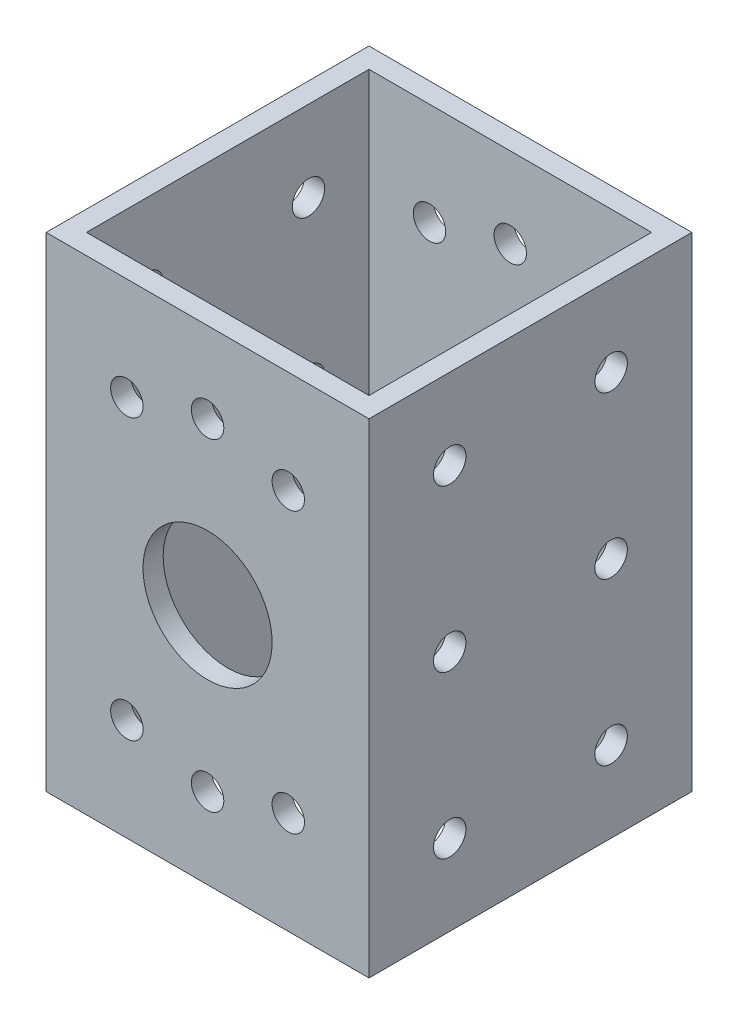
ISO-10303-21;
HEADER;
FILE_DESCRIPTION(('STEP AP214'),'2;1');
FILE_NAME('part.step','',(''),(''),'','','');
FILE_SCHEMA(('AUTOMOTIVE_DESIGN { 1 0 10303 214 1 1 1 1 }'));
ENDSEC;
DATA;
#1=APPLICATION_CONTEXT('core data for automotive mechanical design processes');
#2=APPLICATION_PROTOCOL_DEFINITION('international standard','automotive_design',2000,#1);
#3=PRODUCT_CONTEXT('',#1,'mechanical');
#4=PRODUCT('Part','Part','',(#3));
#5=PRODUCT_RELATED_PRODUCT_CATEGORY('part','',(#4));
#6=PRODUCT_DEFINITION_FORMATION('','',#4);
#7=PRODUCT_DEFINITION_CONTEXT('part definition',#1,'design');
#8=PRODUCT_DEFINITION('design','',#6,#7);
#9=PRODUCT_DEFINITION_SHAPE('','',#8);
#10=(LENGTH_UNIT() NAMED_UNIT(*) SI_UNIT(.MILLI.,.METRE.));
#11=(NAMED_UNIT(*) PLANE_ANGLE_UNIT() SI_UNIT($,.RADIAN.));
#12=(NAMED_UNIT(*) SI_UNIT($,.STERADIAN.) SOLID_ANGLE_UNIT());
#13=UNCERTAINTY_MEASURE_WITH_UNIT(LENGTH_MEASURE(1.E-05),#10,'distance_accuracy_value','');
#14=(GEOMETRIC_REPRESENTATION_CONTEXT(3) GLOBAL_UNCERTAINTY_ASSIGNED_CONTEXT((#13)) GLOBAL_UNIT_ASSIGNED_CONTEXT((#10,
#11,#12)) REPRESENTATION_CONTEXT('',''));
#15=CARTESIAN_POINT('',(0.,0.,0.));
#16=DIRECTION('',(0.,0.,1.));
#17=DIRECTION('',(1.,0.,0.));
#18=AXIS2_PLACEMENT_3D('',#15,#16,#17);
#19=CARTESIAN_POINT('',(0.,76.2,0.));
#20=DIRECTION('',(0.,-1.,0.));
#21=DIRECTION('',(0.,0.,-1.));
#22=AXIS2_PLACEMENT_3D('',#19,#20,#21);
#23=PLANE('',#22);
#24=DIRECTION('',(0.,0.,-1.));
#25=VECTOR('',#24,1.);
#26=CARTESIAN_POINT('',(25.4,76.2,25.4));
#27=LINE('',#26,#25);
#28=CARTESIAN_POINT('',(25.4,76.2,25.4));
#29=VERTEX_POINT('',#28);
#30=CARTESIAN_POINT('',(25.4,76.2,-25.4));
#31=VERTEX_POINT('',#30);
#32=EDGE_CURVE('E144',#29,#31,#27,.T.);
#33=ORIENTED_EDGE('',*,*,#32,.T.);
#34=DIRECTION('',(-1.,0.,0.));
#35=VECTOR('',#34,1.);
#36=CARTESIAN_POINT('',(-25.4,76.2,-25.4));
#37=LINE('',#36,#35);
#38=CARTESIAN_POINT('',(-25.4,76.2,-25.4));
#39=VERTEX_POINT('',#38);
#40=EDGE_CURVE('E147',#31,#39,#37,.T.);
#41=ORIENTED_EDGE('',*,*,#40,.T.);
#42=DIRECTION('',(0.,0.,1.));
#43=VECTOR('',#42,1.);
#44=CARTESIAN_POINT('',(-25.4,76.2,25.4));
#45=LINE('',#44,#43);
#46=CARTESIAN_POINT('',(-25.4,76.2,25.4));
#47=VERTEX_POINT('',#46);
#48=EDGE_CURVE('E150',#39,#47,#45,.T.);
#49=ORIENTED_EDGE('',*,*,#48,.T.);
#50=DIRECTION('',(1.,0.,0.));
#51=VECTOR('',#50,1.);
#52=CARTESIAN_POINT('',(-25.4,76.2,25.4));
#53=LINE('',#52,#51);
#54=EDGE_CURVE('E152',#47,#29,#53,.T.);
#55=ORIENTED_EDGE('',*,*,#54,.T.);
#56=EDGE_LOOP('',(#33,#41,#49,#55));
#57=FACE_BOUND('',#56,.T.);
#58=DIRECTION('',(0.,0.,-1.));
#59=VECTOR('',#58,1.);
#60=CARTESIAN_POINT('',(22.225,76.2,22.225));
#61=LINE('',#60,#59);
#62=CARTESIAN_POINT('',(22.225,76.2,22.225));
#63=VERTEX_POINT('',#62);
#64=CARTESIAN_POINT('',(22.225,76.2,-22.225));
#65=VERTEX_POINT('',#64);
#66=EDGE_CURVE('E106',#63,#65,#61,.T.);
#67=ORIENTED_EDGE('',*,*,#66,.F.);
#68=DIRECTION('',(1.,0.,0.));
#69=VECTOR('',#68,1.);
#70=CARTESIAN_POINT('',(-22.225,76.2,22.225));
#71=LINE('',#70,#69);
#72=CARTESIAN_POINT('',(-22.225,76.2,22.225));
#73=VERTEX_POINT('',#72);
#74=EDGE_CURVE('E128',#73,#63,#71,.T.);
#75=ORIENTED_EDGE('',*,*,#74,.F.);
#76=DIRECTION('',(0.,0.,1.));
#77=VECTOR('',#76,1.);
#78=CARTESIAN_POINT('',(-22.225,76.2,22.225));
#79=LINE('',#78,#77);
#80=CARTESIAN_POINT('',(-22.225,76.2,-22.225));
#81=VERTEX_POINT('',#80);
#82=EDGE_CURVE('E126',#81,#73,#79,.T.);
#83=ORIENTED_EDGE('',*,*,#82,.F.);
#84=DIRECTION('',(-1.,0.,0.));
#85=VECTOR('',#84,1.);
#86=CARTESIAN_POINT('',(-22.225,76.2,-22.225));
#87=LINE('',#86,#85);
#88=EDGE_CURVE('E114',#65,#81,#87,.T.);
#89=ORIENTED_EDGE('',*,*,#88,.F.);
#90=EDGE_LOOP('',(#67,#75,#83,#89));
#91=FACE_BOUND('',#90,.T.);
#92=ADVANCED_FACE('F39',(#57,#91),#23,.F.);
#93=CARTESIAN_POINT('',(0.,0.,0.));
#94=DIRECTION('',(0.,-1.,0.));
#95=DIRECTION('',(0.,0.,-1.));
#96=AXIS2_PLACEMENT_3D('',#93,#94,#95);
#97=PLANE('',#96);
#98=DIRECTION('',(0.,0.,-1.));
#99=VECTOR('',#98,1.);
#100=CARTESIAN_POINT('',(25.4,0.,25.4));
#101=LINE('',#100,#99);
#102=CARTESIAN_POINT('',(25.4,0.,25.4));
#103=VERTEX_POINT('',#102);
#104=CARTESIAN_POINT('',(25.4,0.,-25.4));
#105=VERTEX_POINT('',#104);
#106=EDGE_CURVE('E122',#103,#105,#101,.T.);
#107=ORIENTED_EDGE('',*,*,#106,.F.);
#108=DIRECTION('',(1.,0.,0.));
#109=VECTOR('',#108,1.);
#110=CARTESIAN_POINT('',(-25.4,0.,25.4));
#111=LINE('',#110,#109);
#112=CARTESIAN_POINT('',(-25.4,0.,25.4));
#113=VERTEX_POINT('',#112);
#114=EDGE_CURVE('E148',#113,#103,#111,.T.);
#115=ORIENTED_EDGE('',*,*,#114,.F.);
#116=DIRECTION('',(0.,0.,1.));
#117=VECTOR('',#116,1.);
#118=CARTESIAN_POINT('',(-25.4,0.,25.4));
#119=LINE('',#118,#117);
#120=CARTESIAN_POINT('',(-25.4,0.,-25.4));
#121=VERTEX_POINT('',#120);
#122=EDGE_CURVE('E159',#121,#113,#119,.T.);
#123=ORIENTED_EDGE('',*,*,#122,.F.);
#124=DIRECTION('',(-1.,0.,0.));
#125=VECTOR('',#124,1.);
#126=CARTESIAN_POINT('',(-25.4,0.,-25.4));
#127=LINE('',#126,#125);
#128=EDGE_CURVE('E157',#105,#121,#127,.T.);
#129=ORIENTED_EDGE('',*,*,#128,.F.);
#130=EDGE_LOOP('',(#107,#115,#123,#129));
#131=FACE_BOUND('',#130,.T.);
#132=DIRECTION('',(1.,0.,0.));
#133=VECTOR('',#132,1.);
#134=CARTESIAN_POINT('',(-22.225,0.,22.225));
#135=LINE('',#134,#133);
#136=CARTESIAN_POINT('',(-22.225,0.,22.225));
#137=VERTEX_POINT('',#136);
#138=CARTESIAN_POINT('',(22.225,0.,22.225));
#139=VERTEX_POINT('',#138);
#140=EDGE_CURVE('E115',#137,#139,#135,.T.);
#141=ORIENTED_EDGE('',*,*,#140,.T.);
#142=DIRECTION('',(0.,0.,-1.));
#143=VECTOR('',#142,1.);
#144=CARTESIAN_POINT('',(22.225,0.,22.225));
#145=LINE('',#144,#143);
#146=CARTESIAN_POINT('',(22.225,0.,-22.225));
#147=VERTEX_POINT('',#146);
#148=EDGE_CURVE('E64',#139,#147,#145,.T.);
#149=ORIENTED_EDGE('',*,*,#148,.T.);
#150=DIRECTION('',(-1.,0.,0.));
#151=VECTOR('',#150,1.);
#152=CARTESIAN_POINT('',(-22.225,0.,-22.225));
#153=LINE('',#152,#151);
#154=CARTESIAN_POINT('',(-22.225,0.,-22.225));
#155=VERTEX_POINT('',#154);
#156=EDGE_CURVE('E121',#147,#155,#153,.T.);
#157=ORIENTED_EDGE('',*,*,#156,.T.);
#158=DIRECTION('',(0.,0.,1.));
#159=VECTOR('',#158,1.);
#160=CARTESIAN_POINT('',(-22.225,0.,22.225));
#161=LINE('',#160,#159);
#162=EDGE_CURVE('E136',#155,#137,#161,.T.);
#163=ORIENTED_EDGE('',*,*,#162,.T.);
#164=EDGE_LOOP('',(#141,#149,#157,#163));
#165=FACE_BOUND('',#164,.T.);
#166=ADVANCED_FACE('F278',(#131,#165),#97,.T.);
#167=CARTESIAN_POINT('',(25.4,76.2,25.4));
#168=DIRECTION('',(-1.,0.,0.));
#169=DIRECTION('',(0.,0.,1.));
#170=AXIS2_PLACEMENT_3D('',#167,#168,#169);
#171=PLANE('',#170);
#172=CARTESIAN_POINT('',(25.4,63.5,12.7));
#173=DIRECTION('',(-1.,0.,0.));
#174=DIRECTION('',(0.,0.,1.));
#175=AXIS2_PLACEMENT_3D('',#172,#173,#174);
#176=CIRCLE('',#175,2.5527);
#177=CARTESIAN_POINT('',(25.4,63.5,15.2527));
#178=VERTEX_POINT('',#177);
#179=EDGE_CURVE('E450',#178,#178,#176,.T.);
#180=ORIENTED_EDGE('',*,*,#179,.T.);
#181=EDGE_LOOP('',(#180));
#182=FACE_BOUND('',#181,.T.);
#183=CARTESIAN_POINT('',(25.4,38.1,12.7));
#184=DIRECTION('',(-1.,0.,0.));
#185=DIRECTION('',(0.,0.,1.));
#186=AXIS2_PLACEMENT_3D('',#183,#184,#185);
#187=CIRCLE('',#186,2.5527);
#188=CARTESIAN_POINT('',(25.4,38.1,15.2527));
#189=VERTEX_POINT('',#188);
#190=EDGE_CURVE('E456',#189,#189,#187,.T.);
#191=ORIENTED_EDGE('',*,*,#190,.T.);
#192=EDGE_LOOP('',(#191));
#193=FACE_BOUND('',#192,.T.);
#194=CARTESIAN_POINT('',(25.4,12.7,12.7));
#195=DIRECTION('',(-1.,0.,0.));
#196=DIRECTION('',(0.,0.,1.));
#197=AXIS2_PLACEMENT_3D('',#194,#195,#196);
#198=CIRCLE('',#197,2.5527);
#199=CARTESIAN_POINT('',(25.4,12.7,15.2527));
#200=VERTEX_POINT('',#199);
#201=EDGE_CURVE('E462',#200,#200,#198,.T.);
#202=ORIENTED_EDGE('',*,*,#201,.T.);
#203=EDGE_LOOP('',(#202));
#204=FACE_BOUND('',#203,.T.);
#205=CARTESIAN_POINT('',(25.4,63.5,-12.7));
#206=DIRECTION('',(-1.,0.,0.));
#207=DIRECTION('',(0.,0.,1.));
#208=AXIS2_PLACEMENT_3D('',#205,#206,#207);
#209=CIRCLE('',#208,2.5527);
#210=CARTESIAN_POINT('',(25.4,63.5,-10.1473));
#211=VERTEX_POINT('',#210);
#212=EDGE_CURVE('E468',#211,#211,#209,.T.);
#213=ORIENTED_EDGE('',*,*,#212,.T.);
#214=EDGE_LOOP('',(#213));
#215=FACE_BOUND('',#214,.T.);
#216=CARTESIAN_POINT('',(25.4,38.1,-12.7));
#217=DIRECTION('',(-1.,0.,0.));
#218=DIRECTION('',(0.,0.,1.));
#219=AXIS2_PLACEMENT_3D('',#216,#217,#218);
#220=CIRCLE('',#219,2.5527);
#221=CARTESIAN_POINT('',(25.4,38.1,-10.1473));
#222=VERTEX_POINT('',#221);
#223=EDGE_CURVE('E474',#222,#222,#220,.T.);
#224=ORIENTED_EDGE('',*,*,#223,.T.);
#225=EDGE_LOOP('',(#224));
#226=FACE_BOUND('',#225,.T.);
#227=CARTESIAN_POINT('',(25.4,12.7,-12.7));
#228=DIRECTION('',(-1.,0.,0.));
#229=DIRECTION('',(0.,0.,1.));
#230=AXIS2_PLACEMENT_3D('',#227,#228,#229);
#231=CIRCLE('',#230,2.5527);
#232=CARTESIAN_POINT('',(25.4,12.7,-10.1473));
#233=VERTEX_POINT('',#232);
#234=EDGE_CURVE('E478',#233,#233,#231,.T.);
#235=ORIENTED_EDGE('',*,*,#234,.T.);
#236=EDGE_LOOP('',(#235));
#237=FACE_BOUND('',#236,.T.);
#238=ORIENTED_EDGE('',*,*,#106,.T.);
#239=DIRECTION('',(0.,-1.,0.));
#240=VECTOR('',#239,1.);
#241=CARTESIAN_POINT('',(25.4,76.2,-25.4));
#242=LINE('',#241,#240);
#243=EDGE_CURVE('E11',#31,#105,#242,.T.);
#244=ORIENTED_EDGE('',*,*,#243,.F.);
#245=ORIENTED_EDGE('',*,*,#32,.F.);
#246=DIRECTION('',(0.,-1.,0.));
#247=VECTOR('',#246,1.);
#248=CARTESIAN_POINT('',(25.4,76.2,25.4));
#249=LINE('',#248,#247);
#250=EDGE_CURVE('E154',#29,#103,#249,.T.);
#251=ORIENTED_EDGE('',*,*,#250,.T.);
#252=EDGE_LOOP('',(#238,#244,#245,#251));
#253=FACE_BOUND('',#252,.T.);
#254=ADVANCED_FACE('F41',(#182,#193,#204,#215,#226,#237,#253),#171,.F.);
#255=CARTESIAN_POINT('',(-25.4,76.2,-25.4));
#256=DIRECTION('',(0.,0.,1.));
#257=DIRECTION('',(1.,0.,0.));
#258=AXIS2_PLACEMENT_3D('',#255,#256,#257);
#259=PLANE('',#258);
#260=CARTESIAN_POINT('',(0.,38.1,-25.4));
#261=DIRECTION('',(0.,0.,1.));
#262=DIRECTION('',(1.,0.,0.));
#263=AXIS2_PLACEMENT_3D('',#260,#261,#262);
#264=CIRCLE('',#263,10.16);
#265=CARTESIAN_POINT('',(10.16,38.1,-25.4));
#266=VERTEX_POINT('',#265);
#267=EDGE_CURVE('E196',#266,#266,#264,.T.);
#268=ORIENTED_EDGE('',*,*,#267,.T.);
#269=EDGE_LOOP('',(#268));
#270=FACE_BOUND('',#269,.T.);
#271=CARTESIAN_POINT('',(-12.6999999999997,16.1029547438751,-25.4));
#272=DIRECTION('',(0.,0.,1.));
#273=DIRECTION('',(0.866025403784445,-0.499999999999989,0.));
#274=AXIS2_PLACEMENT_3D('',#271,#272,#273);
#275=CIRCLE('',#274,2.5527);
#276=CARTESIAN_POINT('',(-10.4892969517592,14.8266047438751,-25.4));
#277=VERTEX_POINT('',#276);
#278=EDGE_CURVE('E232',#277,#277,#275,.T.);
#279=ORIENTED_EDGE('',*,*,#278,.T.);
#280=EDGE_LOOP('',(#279));
#281=FACE_BOUND('',#280,.T.);
#282=CARTESIAN_POINT('',(-12.7000000000002,60.0970452561247,-25.4));
#283=DIRECTION('',(0.,0.,1.));
#284=DIRECTION('',(-0.866025403784435,-0.500000000000007,0.));
#285=AXIS2_PLACEMENT_3D('',#282,#283,#284);
#286=CIRCLE('',#285,2.5527);
#287=CARTESIAN_POINT('',(-14.9107030482407,58.8206952561246,-25.4));
#288=VERTEX_POINT('',#287);
#289=EDGE_CURVE('E226',#288,#288,#286,.T.);
#290=ORIENTED_EDGE('',*,*,#289,.T.);
#291=EDGE_LOOP('',(#290));
#292=FACE_BOUND('',#291,.T.);
#293=CARTESIAN_POINT('',(0.,63.5,-25.4));
#294=DIRECTION('',(0.,0.,1.));
#295=DIRECTION('',(-1.,0.,0.));
#296=AXIS2_PLACEMENT_3D('',#293,#294,#295);
#297=CIRCLE('',#296,2.5527);
#298=CARTESIAN_POINT('',(-2.5527,63.5,-25.4));
#299=VERTEX_POINT('',#298);
#300=EDGE_CURVE('E220',#299,#299,#297,.T.);
#301=ORIENTED_EDGE('',*,*,#300,.T.);
#302=EDGE_LOOP('',(#301));
#303=FACE_BOUND('',#302,.T.);
#304=CARTESIAN_POINT('',(12.6999999999999,60.0970452561248,-25.4));
#305=DIRECTION('',(0.,0.,1.));
#306=DIRECTION('',(-0.866025403784442,0.499999999999995,0.));
#307=AXIS2_PLACEMENT_3D('',#304,#305,#306);
#308=CIRCLE('',#307,2.5527);
#309=CARTESIAN_POINT('',(10.4892969517593,61.3733952561248,-25.4));
#310=VERTEX_POINT('',#309);
#311=EDGE_CURVE('E213',#310,#310,#308,.T.);
#312=ORIENTED_EDGE('',*,*,#311,.T.);
#313=EDGE_LOOP('',(#312));
#314=FACE_BOUND('',#313,.T.);
#315=CARTESIAN_POINT('',(12.7,16.1029547438753,-25.4));
#316=DIRECTION('',(0.,0.,1.));
#317=DIRECTION('',(0.866025403784438,0.500000000000001,0.));
#318=AXIS2_PLACEMENT_3D('',#315,#316,#317);
#319=CIRCLE('',#318,2.5527);
#320=CARTESIAN_POINT('',(14.9107030482406,17.3793047438753,-25.4));
#321=VERTEX_POINT('',#320);
#322=EDGE_CURVE('E177',#321,#321,#319,.T.);
#323=ORIENTED_EDGE('',*,*,#322,.T.);
#324=EDGE_LOOP('',(#323));
#325=FACE_BOUND('',#324,.T.);
#326=CARTESIAN_POINT('',(0.,12.7,-25.4));
#327=DIRECTION('',(0.,0.,1.));
#328=DIRECTION('',(1.,0.,0.));
#329=AXIS2_PLACEMENT_3D('',#326,#327,#328);
#330=CIRCLE('',#329,2.5527);
#331=CARTESIAN_POINT('',(2.5527,12.7,-25.4));
#332=VERTEX_POINT('',#331);
#333=EDGE_CURVE('E172',#332,#332,#330,.T.);
#334=ORIENTED_EDGE('',*,*,#333,.T.);
#335=EDGE_LOOP('',(#334));
#336=FACE_BOUND('',#335,.T.);
#337=ORIENTED_EDGE('',*,*,#128,.T.);
#338=DIRECTION('',(0.,-1.,0.));
#339=VECTOR('',#338,1.);
#340=CARTESIAN_POINT('',(-25.4,76.2,-25.4));
#341=LINE('',#340,#339);
#342=EDGE_CURVE('E48',#39,#121,#341,.T.);
#343=ORIENTED_EDGE('',*,*,#342,.F.);
#344=ORIENTED_EDGE('',*,*,#40,.F.);
#345=ORIENTED_EDGE('',*,*,#243,.T.);
#346=EDGE_LOOP('',(#337,#343,#344,#345));
#347=FACE_BOUND('',#346,.T.);
#348=ADVANCED_FACE('F292',(#270,#281,#292,#303,#314,#325,#336,#347),#259,.F.);
#349=CARTESIAN_POINT('',(-25.4,76.2,25.4));
#350=DIRECTION('',(1.,0.,0.));
#351=DIRECTION('',(0.,0.,-1.));
#352=AXIS2_PLACEMENT_3D('',#349,#350,#351);
#353=PLANE('',#352);
#354=CARTESIAN_POINT('',(-25.4,63.5,12.7));
#355=DIRECTION('',(-1.,0.,0.));
#356=DIRECTION('',(0.,0.,1.));
#357=AXIS2_PLACEMENT_3D('',#354,#355,#356);
#358=CIRCLE('',#357,2.5527);
#359=CARTESIAN_POINT('',(-25.4,63.5,15.2527));
#360=VERTEX_POINT('',#359);
#361=EDGE_CURVE('E419',#360,#360,#358,.T.);
#362=ORIENTED_EDGE('',*,*,#361,.F.);
#363=EDGE_LOOP('',(#362));
#364=FACE_BOUND('',#363,.T.);
#365=CARTESIAN_POINT('',(-25.4,38.1,12.7));
#366=DIRECTION('',(-1.,0.,0.));
#367=DIRECTION('',(0.,0.,1.));
#368=AXIS2_PLACEMENT_3D('',#365,#366,#367);
#369=CIRCLE('',#368,2.5527);
#370=CARTESIAN_POINT('',(-25.4,38.1,15.2527));
#371=VERTEX_POINT('',#370);
#372=EDGE_CURVE('E423',#371,#371,#369,.T.);
#373=ORIENTED_EDGE('',*,*,#372,.F.);
#374=EDGE_LOOP('',(#373));
#375=FACE_BOUND('',#374,.T.);
#376=CARTESIAN_POINT('',(-25.4,12.7,12.7));
#377=DIRECTION('',(-1.,0.,0.));
#378=DIRECTION('',(0.,0.,1.));
#379=AXIS2_PLACEMENT_3D('',#376,#377,#378);
#380=CIRCLE('',#379,2.5527);
#381=CARTESIAN_POINT('',(-25.4,12.7,15.2527));
#382=VERTEX_POINT('',#381);
#383=EDGE_CURVE('E432',#382,#382,#380,.T.);
#384=ORIENTED_EDGE('',*,*,#383,.F.);
#385=EDGE_LOOP('',(#384));
#386=FACE_BOUND('',#385,.T.);
#387=CARTESIAN_POINT('',(-25.4,63.5,-12.7));
#388=DIRECTION('',(-1.,0.,0.));
#389=DIRECTION('',(0.,0.,1.));
#390=AXIS2_PLACEMENT_3D('',#387,#388,#389);
#391=CIRCLE('',#390,2.5527);
#392=CARTESIAN_POINT('',(-25.4,63.5,-10.1473));
#393=VERTEX_POINT('',#392);
#394=EDGE_CURVE('E438',#393,#393,#391,.T.);
#395=ORIENTED_EDGE('',*,*,#394,.F.);
#396=EDGE_LOOP('',(#395));
#397=FACE_BOUND('',#396,.T.);
#398=CARTESIAN_POINT('',(-25.4,38.1,-12.7));
#399=DIRECTION('',(-1.,0.,0.));
#400=DIRECTION('',(0.,0.,1.));
#401=AXIS2_PLACEMENT_3D('',#398,#399,#400);
#402=CIRCLE('',#401,2.5527);
#403=CARTESIAN_POINT('',(-25.4,38.1,-10.1473));
#404=VERTEX_POINT('',#403);
#405=EDGE_CURVE('E444',#404,#404,#402,.T.);
#406=ORIENTED_EDGE('',*,*,#405,.F.);
#407=EDGE_LOOP('',(#406));
#408=FACE_BOUND('',#407,.T.);
#409=CARTESIAN_POINT('',(-25.4,12.7,-12.7));
#410=DIRECTION('',(-1.,0.,0.));
#411=DIRECTION('',(0.,0.,1.));
#412=AXIS2_PLACEMENT_3D('',#409,#410,#411);
#413=CIRCLE('',#412,2.5527);
#414=CARTESIAN_POINT('',(-25.4,12.7,-10.1473));
#415=VERTEX_POINT('',#414);
#416=EDGE_CURVE('E477',#415,#415,#413,.T.);
#417=ORIENTED_EDGE('',*,*,#416,.F.);
#418=EDGE_LOOP('',(#417));
#419=FACE_BOUND('',#418,.T.);
#420=ORIENTED_EDGE('',*,*,#122,.T.);
#421=DIRECTION('',(0.,-1.,0.));
#422=VECTOR('',#421,1.);
#423=CARTESIAN_POINT('',(-25.4,76.2,25.4));
#424=LINE('',#423,#422);
#425=EDGE_CURVE('E164',#47,#113,#424,.T.);
#426=ORIENTED_EDGE('',*,*,#425,.F.);
#427=ORIENTED_EDGE('',*,*,#48,.F.);
#428=ORIENTED_EDGE('',*,*,#342,.T.);
#429=EDGE_LOOP('',(#420,#426,#427,#428));
#430=FACE_BOUND('',#429,.T.);
#431=ADVANCED_FACE('F289',(#364,#375,#386,#397,#408,#419,#430),#353,.F.);
#432=CARTESIAN_POINT('',(-25.4,76.2,25.4));
#433=DIRECTION('',(0.,0.,-1.));
#434=DIRECTION('',(-1.,0.,0.));
#435=AXIS2_PLACEMENT_3D('',#432,#433,#434);
#436=PLANE('',#435);
#437=CARTESIAN_POINT('',(0.,38.1,25.4));
#438=DIRECTION('',(0.,0.,1.));
#439=DIRECTION('',(1.,0.,0.));
#440=AXIS2_PLACEMENT_3D('',#437,#438,#439);
#441=CIRCLE('',#440,10.16);
#442=CARTESIAN_POINT('',(10.16,38.1,25.4));
#443=VERTEX_POINT('',#442);
#444=EDGE_CURVE('E203',#443,#443,#441,.T.);
#445=ORIENTED_EDGE('',*,*,#444,.F.);
#446=EDGE_LOOP('',(#445));
#447=FACE_BOUND('',#446,.T.);
#448=CARTESIAN_POINT('',(-12.6999999999997,16.1029547438751,25.4));
#449=DIRECTION('',(0.,0.,1.));
#450=DIRECTION('',(0.866025403784445,-0.499999999999989,0.));
#451=AXIS2_PLACEMENT_3D('',#448,#449,#450);
#452=CIRCLE('',#451,2.5527);
#453=CARTESIAN_POINT('',(-10.4892969517592,14.8266047438751,25.4));
#454=VERTEX_POINT('',#453);
#455=EDGE_CURVE('E200',#454,#454,#452,.T.);
#456=ORIENTED_EDGE('',*,*,#455,.F.);
#457=EDGE_LOOP('',(#456));
#458=FACE_BOUND('',#457,.T.);
#459=CARTESIAN_POINT('',(-12.7000000000002,60.0970452561247,25.4));
#460=DIRECTION('',(0.,0.,1.));
#461=DIRECTION('',(-0.866025403784435,-0.500000000000007,0.));
#462=AXIS2_PLACEMENT_3D('',#459,#460,#461);
#463=CIRCLE('',#462,2.5527);
#464=CARTESIAN_POINT('',(-14.9107030482407,58.8206952561246,25.4));
#465=VERTEX_POINT('',#464);
#466=EDGE_CURVE('E229',#465,#465,#463,.T.);
#467=ORIENTED_EDGE('',*,*,#466,.F.);
#468=EDGE_LOOP('',(#467));
#469=FACE_BOUND('',#468,.T.);
#470=CARTESIAN_POINT('',(0.,63.5,25.4));
#471=DIRECTION('',(0.,0.,1.));
#472=DIRECTION('',(-1.,0.,0.));
#473=AXIS2_PLACEMENT_3D('',#470,#471,#472);
#474=CIRCLE('',#473,2.5527);
#475=CARTESIAN_POINT('',(-2.5527,63.5,25.4));
#476=VERTEX_POINT('',#475);
#477=EDGE_CURVE('E223',#476,#476,#474,.T.);
#478=ORIENTED_EDGE('',*,*,#477,.F.);
#479=EDGE_LOOP('',(#478));
#480=FACE_BOUND('',#479,.T.);
#481=CARTESIAN_POINT('',(12.6999999999999,60.0970452561248,25.4));
#482=DIRECTION('',(0.,0.,1.));
#483=DIRECTION('',(-0.866025403784442,0.499999999999995,0.));
#484=AXIS2_PLACEMENT_3D('',#481,#482,#483);
#485=CIRCLE('',#484,2.5527);
#486=CARTESIAN_POINT('',(10.4892969517593,61.3733952561248,25.4));
#487=VERTEX_POINT('',#486);
#488=EDGE_CURVE('E217',#487,#487,#485,.T.);
#489=ORIENTED_EDGE('',*,*,#488,.F.);
#490=EDGE_LOOP('',(#489));
#491=FACE_BOUND('',#490,.T.);
#492=CARTESIAN_POINT('',(12.7,16.1029547438753,25.4));
#493=DIRECTION('',(0.,0.,1.));
#494=DIRECTION('',(0.866025403784438,0.500000000000001,0.));
#495=AXIS2_PLACEMENT_3D('',#492,#493,#494);
#496=CIRCLE('',#495,2.5527);
#497=CARTESIAN_POINT('',(14.9107030482406,17.3793047438753,25.4));
#498=VERTEX_POINT('',#497);
#499=EDGE_CURVE('E216',#498,#498,#496,.T.);
#500=ORIENTED_EDGE('',*,*,#499,.F.);
#501=EDGE_LOOP('',(#500));
#502=FACE_BOUND('',#501,.T.);
#503=CARTESIAN_POINT('',(0.,12.7,25.4));
#504=DIRECTION('',(0.,0.,1.));
#505=DIRECTION('',(1.,0.,0.));
#506=AXIS2_PLACEMENT_3D('',#503,#504,#505);
#507=CIRCLE('',#506,2.5527);
#508=CARTESIAN_POINT('',(2.5527,12.7,25.4));
#509=VERTEX_POINT('',#508);
#510=EDGE_CURVE('E251',#509,#509,#507,.T.);
#511=ORIENTED_EDGE('',*,*,#510,.F.);
#512=EDGE_LOOP('',(#511));
#513=FACE_BOUND('',#512,.T.);
#514=ORIENTED_EDGE('',*,*,#114,.T.);
#515=ORIENTED_EDGE('',*,*,#250,.F.);
#516=ORIENTED_EDGE('',*,*,#54,.F.);
#517=ORIENTED_EDGE('',*,*,#425,.T.);
#518=EDGE_LOOP('',(#514,#515,#516,#517));
#519=FACE_BOUND('',#518,.T.);
#520=ADVANCED_FACE('F272',(#447,#458,#469,#480,#491,#502,#513,#519),#436,.F.);
#521=CARTESIAN_POINT('',(22.225,76.2,22.225));
#522=DIRECTION('',(-1.,0.,0.));
#523=DIRECTION('',(0.,0.,1.));
#524=AXIS2_PLACEMENT_3D('',#521,#522,#523);
#525=PLANE('',#524);
#526=CARTESIAN_POINT('',(22.225,63.5,12.7));
#527=DIRECTION('',(-1.,0.,0.));
#528=DIRECTION('',(0.,0.,1.));
#529=AXIS2_PLACEMENT_3D('',#526,#527,#528);
#530=CIRCLE('',#529,2.5527);
#531=CARTESIAN_POINT('',(22.225,63.5,15.2527));
#532=VERTEX_POINT('',#531);
#533=EDGE_CURVE('E447',#532,#532,#530,.T.);
#534=ORIENTED_EDGE('',*,*,#533,.F.);
#535=EDGE_LOOP('',(#534));
#536=FACE_BOUND('',#535,.T.);
#537=CARTESIAN_POINT('',(22.225,38.1,12.7));
#538=DIRECTION('',(-1.,0.,0.));
#539=DIRECTION('',(0.,0.,1.));
#540=AXIS2_PLACEMENT_3D('',#537,#538,#539);
#541=CIRCLE('',#540,2.5527);
#542=CARTESIAN_POINT('',(22.225,38.1,15.2527));
#543=VERTEX_POINT('',#542);
#544=EDGE_CURVE('E453',#543,#543,#541,.T.);
#545=ORIENTED_EDGE('',*,*,#544,.F.);
#546=EDGE_LOOP('',(#545));
#547=FACE_BOUND('',#546,.T.);
#548=CARTESIAN_POINT('',(22.225,12.7,12.7));
#549=DIRECTION('',(-1.,0.,0.));
#550=DIRECTION('',(0.,0.,1.));
#551=AXIS2_PLACEMENT_3D('',#548,#549,#550);
#552=CIRCLE('',#551,2.5527);
#553=CARTESIAN_POINT('',(22.225,12.7,15.2527));
#554=VERTEX_POINT('',#553);
#555=EDGE_CURVE('E459',#554,#554,#552,.T.);
#556=ORIENTED_EDGE('',*,*,#555,.F.);
#557=EDGE_LOOP('',(#556));
#558=FACE_BOUND('',#557,.T.);
#559=CARTESIAN_POINT('',(22.225,63.5,-12.7));
#560=DIRECTION('',(-1.,0.,0.));
#561=DIRECTION('',(0.,0.,1.));
#562=AXIS2_PLACEMENT_3D('',#559,#560,#561);
#563=CIRCLE('',#562,2.5527);
#564=CARTESIAN_POINT('',(22.225,63.5,-10.1473));
#565=VERTEX_POINT('',#564);
#566=EDGE_CURVE('E465',#565,#565,#563,.T.);
#567=ORIENTED_EDGE('',*,*,#566,.F.);
#568=EDGE_LOOP('',(#567));
#569=FACE_BOUND('',#568,.T.);
#570=CARTESIAN_POINT('',(22.225,38.1,-12.7));
#571=DIRECTION('',(-1.,0.,0.));
#572=DIRECTION('',(0.,0.,1.));
#573=AXIS2_PLACEMENT_3D('',#570,#571,#572);
#574=CIRCLE('',#573,2.5527);
#575=CARTESIAN_POINT('',(22.225,38.1,-10.1473));
#576=VERTEX_POINT('',#575);
#577=EDGE_CURVE('E471',#576,#576,#574,.T.);
#578=ORIENTED_EDGE('',*,*,#577,.F.);
#579=EDGE_LOOP('',(#578));
#580=FACE_BOUND('',#579,.T.);
#581=CARTESIAN_POINT('',(22.225,12.7,-12.7));
#582=DIRECTION('',(-1.,0.,0.));
#583=DIRECTION('',(0.,0.,1.));
#584=AXIS2_PLACEMENT_3D('',#581,#582,#583);
#585=CIRCLE('',#584,2.5527);
#586=CARTESIAN_POINT('',(22.225,12.7,-10.1473));
#587=VERTEX_POINT('',#586);
#588=EDGE_CURVE('E208',#587,#587,#585,.T.);
#589=ORIENTED_EDGE('',*,*,#588,.F.);
#590=EDGE_LOOP('',(#589));
#591=FACE_BOUND('',#590,.T.);
#592=ORIENTED_EDGE('',*,*,#148,.F.);
#593=DIRECTION('',(0.,-1.,0.));
#594=VECTOR('',#593,1.);
#595=CARTESIAN_POINT('',(22.225,76.2,22.225));
#596=LINE('',#595,#594);
#597=EDGE_CURVE('E110',#63,#139,#596,.T.);
#598=ORIENTED_EDGE('',*,*,#597,.F.);
#599=ORIENTED_EDGE('',*,*,#66,.T.);
#600=DIRECTION('',(0.,-1.,0.));
#601=VECTOR('',#600,1.);
#602=CARTESIAN_POINT('',(22.225,76.2,-22.225));
#603=LINE('',#602,#601);
#604=EDGE_CURVE('E109',#65,#147,#603,.T.);
#605=ORIENTED_EDGE('',*,*,#604,.T.);
#606=EDGE_LOOP('',(#592,#598,#599,#605));
#607=FACE_BOUND('',#606,.T.);
#608=ADVANCED_FACE('F108',(#536,#547,#558,#569,#580,#591,#607),#525,.T.);
#609=CARTESIAN_POINT('',(-22.225,76.2,-22.225));
#610=DIRECTION('',(0.,0.,1.));
#611=DIRECTION('',(1.,0.,0.));
#612=AXIS2_PLACEMENT_3D('',#609,#610,#611);
#613=PLANE('',#612);
#614=CARTESIAN_POINT('',(0.,38.1,-22.225));
#615=DIRECTION('',(0.,0.,1.));
#616=DIRECTION('',(1.,0.,0.));
#617=AXIS2_PLACEMENT_3D('',#614,#615,#616);
#618=CIRCLE('',#617,10.16);
#619=CARTESIAN_POINT('',(10.16,38.1,-22.225));
#620=VERTEX_POINT('',#619);
#621=EDGE_CURVE('E195',#620,#620,#618,.T.);
#622=ORIENTED_EDGE('',*,*,#621,.F.);
#623=EDGE_LOOP('',(#622));
#624=FACE_BOUND('',#623,.T.);
#625=CARTESIAN_POINT('',(-12.6999999999997,16.1029547438751,-22.225));
#626=DIRECTION('',(0.,0.,1.));
#627=DIRECTION('',(1.,0.,0.));
#628=AXIS2_PLACEMENT_3D('',#625,#626,#627);
#629=CIRCLE('',#628,2.5527);
#630=CARTESIAN_POINT('',(-10.1472999999997,16.1029547438751,-22.225));
#631=VERTEX_POINT('',#630);
#632=EDGE_CURVE('E192',#631,#631,#629,.T.);
#633=ORIENTED_EDGE('',*,*,#632,.F.);
#634=EDGE_LOOP('',(#633));
#635=FACE_BOUND('',#634,.T.);
#636=CARTESIAN_POINT('',(-12.7000000000002,60.0970452561247,-22.225));
#637=DIRECTION('',(0.,0.,1.));
#638=DIRECTION('',(1.,0.,0.));
#639=AXIS2_PLACEMENT_3D('',#636,#637,#638);
#640=CIRCLE('',#639,2.5527);
#641=CARTESIAN_POINT('',(-10.1473000000002,60.0970452561247,-22.225));
#642=VERTEX_POINT('',#641);
#643=EDGE_CURVE('E189',#642,#642,#640,.T.);
#644=ORIENTED_EDGE('',*,*,#643,.F.);
#645=EDGE_LOOP('',(#644));
#646=FACE_BOUND('',#645,.T.);
#647=CARTESIAN_POINT('',(0.,63.5,-22.225));
#648=DIRECTION('',(0.,0.,1.));
#649=DIRECTION('',(1.,0.,0.));
#650=AXIS2_PLACEMENT_3D('',#647,#648,#649);
#651=CIRCLE('',#650,2.5527);
#652=CARTESIAN_POINT('',(2.5527,63.5,-22.225));
#653=VERTEX_POINT('',#652);
#654=EDGE_CURVE('E185',#653,#653,#651,.T.);
#655=ORIENTED_EDGE('',*,*,#654,.F.);
#656=EDGE_LOOP('',(#655));
#657=FACE_BOUND('',#656,.T.);
#658=CARTESIAN_POINT('',(12.6999999999999,60.0970452561248,-22.225));
#659=DIRECTION('',(0.,0.,1.));
#660=DIRECTION('',(1.,0.,0.));
#661=AXIS2_PLACEMENT_3D('',#658,#659,#660);
#662=CIRCLE('',#661,2.5527);
#663=CARTESIAN_POINT('',(15.2526999999999,60.0970452561248,-22.225));
#664=VERTEX_POINT('',#663);
#665=EDGE_CURVE('E181',#664,#664,#662,.T.);
#666=ORIENTED_EDGE('',*,*,#665,.F.);
#667=EDGE_LOOP('',(#666));
#668=FACE_BOUND('',#667,.T.);
#669=CARTESIAN_POINT('',(12.7,16.1029547438753,-22.225));
#670=DIRECTION('',(0.,0.,1.));
#671=DIRECTION('',(1.,0.,0.));
#672=AXIS2_PLACEMENT_3D('',#669,#670,#671);
#673=CIRCLE('',#672,2.5527);
#674=CARTESIAN_POINT('',(15.2527,16.1029547438753,-22.225));
#675=VERTEX_POINT('',#674);
#676=EDGE_CURVE('E176',#675,#675,#673,.T.);
#677=ORIENTED_EDGE('',*,*,#676,.F.);
#678=EDGE_LOOP('',(#677));
#679=FACE_BOUND('',#678,.T.);
#680=CARTESIAN_POINT('',(0.,12.7,-22.225));
#681=DIRECTION('',(0.,0.,1.));
#682=DIRECTION('',(1.,0.,0.));
#683=AXIS2_PLACEMENT_3D('',#680,#681,#682);
#684=CIRCLE('',#683,2.5527);
#685=CARTESIAN_POINT('',(2.5527,12.7,-22.225));
#686=VERTEX_POINT('',#685);
#687=EDGE_CURVE('E134',#686,#686,#684,.T.);
#688=ORIENTED_EDGE('',*,*,#687,.F.);
#689=EDGE_LOOP('',(#688));
#690=FACE_BOUND('',#689,.T.);
#691=ORIENTED_EDGE('',*,*,#156,.F.);
#692=ORIENTED_EDGE('',*,*,#604,.F.);
#693=ORIENTED_EDGE('',*,*,#88,.T.);
#694=DIRECTION('',(0.,-1.,0.));
#695=VECTOR('',#694,1.);
#696=CARTESIAN_POINT('',(-22.225,76.2,-22.225));
#697=LINE('',#696,#695);
#698=EDGE_CURVE('E123',#81,#155,#697,.T.);
#699=ORIENTED_EDGE('',*,*,#698,.T.);
#700=EDGE_LOOP('',(#691,#692,#693,#699));
#701=FACE_BOUND('',#700,.T.);
#702=ADVANCED_FACE('F118',(#624,#635,#646,#657,#668,#679,#690,#701),#613,.T.);
#703=CARTESIAN_POINT('',(-22.225,76.2,22.225));
#704=DIRECTION('',(1.,0.,0.));
#705=DIRECTION('',(0.,0.,-1.));
#706=AXIS2_PLACEMENT_3D('',#703,#704,#705);
#707=PLANE('',#706);
#708=CARTESIAN_POINT('',(-22.225,63.5,12.7));
#709=DIRECTION('',(1.,0.,0.));
#710=DIRECTION('',(0.,0.,-1.));
#711=AXIS2_PLACEMENT_3D('',#708,#709,#710);
#712=CIRCLE('',#711,2.5527);
#713=CARTESIAN_POINT('',(-22.225,63.5,10.1473));
#714=VERTEX_POINT('',#713);
#715=EDGE_CURVE('E416',#714,#714,#712,.T.);
#716=ORIENTED_EDGE('',*,*,#715,.F.);
#717=EDGE_LOOP('',(#716));
#718=FACE_BOUND('',#717,.T.);
#719=CARTESIAN_POINT('',(-22.225,38.1,12.7));
#720=DIRECTION('',(1.,0.,0.));
#721=DIRECTION('',(0.,0.,-1.));
#722=AXIS2_PLACEMENT_3D('',#719,#720,#721);
#723=CIRCLE('',#722,2.5527);
#724=CARTESIAN_POINT('',(-22.225,38.1,10.1473));
#725=VERTEX_POINT('',#724);
#726=EDGE_CURVE('E420',#725,#725,#723,.T.);
#727=ORIENTED_EDGE('',*,*,#726,.F.);
#728=EDGE_LOOP('',(#727));
#729=FACE_BOUND('',#728,.T.);
#730=CARTESIAN_POINT('',(-22.225,12.7,12.7));
#731=DIRECTION('',(1.,0.,0.));
#732=DIRECTION('',(0.,0.,-1.));
#733=AXIS2_PLACEMENT_3D('',#730,#731,#732);
#734=CIRCLE('',#733,2.5527);
#735=CARTESIAN_POINT('',(-22.225,12.7,10.1473));
#736=VERTEX_POINT('',#735);
#737=EDGE_CURVE('E429',#736,#736,#734,.T.);
#738=ORIENTED_EDGE('',*,*,#737,.F.);
#739=EDGE_LOOP('',(#738));
#740=FACE_BOUND('',#739,.T.);
#741=CARTESIAN_POINT('',(-22.225,63.5,-12.7));
#742=DIRECTION('',(1.,0.,0.));
#743=DIRECTION('',(0.,0.,-1.));
#744=AXIS2_PLACEMENT_3D('',#741,#742,#743);
#745=CIRCLE('',#744,2.5527);
#746=CARTESIAN_POINT('',(-22.225,63.5,-15.2527));
#747=VERTEX_POINT('',#746);
#748=EDGE_CURVE('E435',#747,#747,#745,.T.);
#749=ORIENTED_EDGE('',*,*,#748,.F.);
#750=EDGE_LOOP('',(#749));
#751=FACE_BOUND('',#750,.T.);
#752=CARTESIAN_POINT('',(-22.225,38.1,-12.7));
#753=DIRECTION('',(1.,0.,0.));
#754=DIRECTION('',(0.,0.,-1.));
#755=AXIS2_PLACEMENT_3D('',#752,#753,#754);
#756=CIRCLE('',#755,2.5527);
#757=CARTESIAN_POINT('',(-22.225,38.1,-15.2527));
#758=VERTEX_POINT('',#757);
#759=EDGE_CURVE('E441',#758,#758,#756,.T.);
#760=ORIENTED_EDGE('',*,*,#759,.F.);
#761=EDGE_LOOP('',(#760));
#762=FACE_BOUND('',#761,.T.);
#763=CARTESIAN_POINT('',(-22.225,12.7,-12.7));
#764=DIRECTION('',(1.,0.,0.));
#765=DIRECTION('',(0.,0.,-1.));
#766=AXIS2_PLACEMENT_3D('',#763,#764,#765);
#767=CIRCLE('',#766,2.5527);
#768=CARTESIAN_POINT('',(-22.225,12.7,-15.2527));
#769=VERTEX_POINT('',#768);
#770=EDGE_CURVE('E43',#769,#769,#767,.T.);
#771=ORIENTED_EDGE('',*,*,#770,.F.);
#772=EDGE_LOOP('',(#771));
#773=FACE_BOUND('',#772,.T.);
#774=ORIENTED_EDGE('',*,*,#162,.F.);
#775=ORIENTED_EDGE('',*,*,#698,.F.);
#776=ORIENTED_EDGE('',*,*,#82,.T.);
#777=DIRECTION('',(0.,-1.,0.));
#778=VECTOR('',#777,1.);
#779=CARTESIAN_POINT('',(-22.225,76.2,22.225));
#780=LINE('',#779,#778);
#781=EDGE_CURVE('E56',#73,#137,#780,.T.);
#782=ORIENTED_EDGE('',*,*,#781,.T.);
#783=EDGE_LOOP('',(#774,#775,#776,#782));
#784=FACE_BOUND('',#783,.T.);
#785=ADVANCED_FACE('F262',(#718,#729,#740,#751,#762,#773,#784),#707,.T.);
#786=CARTESIAN_POINT('',(-22.225,76.2,22.225));
#787=DIRECTION('',(0.,0.,-1.));
#788=DIRECTION('',(-1.,0.,0.));
#789=AXIS2_PLACEMENT_3D('',#786,#787,#788);
#790=PLANE('',#789);
#791=CARTESIAN_POINT('',(0.,38.1,22.225));
#792=DIRECTION('',(0.,0.,-1.));
#793=DIRECTION('',(-1.,0.,0.));
#794=AXIS2_PLACEMENT_3D('',#791,#792,#793);
#795=CIRCLE('',#794,10.16);
#796=CARTESIAN_POINT('',(-10.16,38.1,22.225));
#797=VERTEX_POINT('',#796);
#798=EDGE_CURVE('E193',#797,#797,#795,.T.);
#799=ORIENTED_EDGE('',*,*,#798,.F.);
#800=EDGE_LOOP('',(#799));
#801=FACE_BOUND('',#800,.T.);
#802=CARTESIAN_POINT('',(-12.6999999999997,16.1029547438751,22.225));
#803=DIRECTION('',(0.,0.,-1.));
#804=DIRECTION('',(-1.,0.,0.));
#805=AXIS2_PLACEMENT_3D('',#802,#803,#804);
#806=CIRCLE('',#805,2.5527);
#807=CARTESIAN_POINT('',(-15.2526999999997,16.1029547438751,22.225));
#808=VERTEX_POINT('',#807);
#809=EDGE_CURVE('E190',#808,#808,#806,.T.);
#810=ORIENTED_EDGE('',*,*,#809,.F.);
#811=EDGE_LOOP('',(#810));
#812=FACE_BOUND('',#811,.T.);
#813=CARTESIAN_POINT('',(-12.7000000000002,60.0970452561247,22.225));
#814=DIRECTION('',(0.,0.,-1.));
#815=DIRECTION('',(-1.,0.,0.));
#816=AXIS2_PLACEMENT_3D('',#813,#814,#815);
#817=CIRCLE('',#816,2.5527);
#818=CARTESIAN_POINT('',(-15.2527000000002,60.0970452561247,22.225));
#819=VERTEX_POINT('',#818);
#820=EDGE_CURVE('E186',#819,#819,#817,.T.);
#821=ORIENTED_EDGE('',*,*,#820,.F.);
#822=EDGE_LOOP('',(#821));
#823=FACE_BOUND('',#822,.T.);
#824=CARTESIAN_POINT('',(0.,63.5,22.225));
#825=DIRECTION('',(0.,0.,-1.));
#826=DIRECTION('',(-1.,0.,0.));
#827=AXIS2_PLACEMENT_3D('',#824,#825,#826);
#828=CIRCLE('',#827,2.5527);
#829=CARTESIAN_POINT('',(-2.5527,63.5,22.225));
#830=VERTEX_POINT('',#829);
#831=EDGE_CURVE('E182',#830,#830,#828,.T.);
#832=ORIENTED_EDGE('',*,*,#831,.F.);
#833=EDGE_LOOP('',(#832));
#834=FACE_BOUND('',#833,.T.);
#835=CARTESIAN_POINT('',(12.6999999999999,60.0970452561248,22.225));
#836=DIRECTION('',(0.,0.,-1.));
#837=DIRECTION('',(-1.,0.,0.));
#838=AXIS2_PLACEMENT_3D('',#835,#836,#837);
#839=CIRCLE('',#838,2.5527);
#840=CARTESIAN_POINT('',(10.1472999999999,60.0970452561248,22.225));
#841=VERTEX_POINT('',#840);
#842=EDGE_CURVE('E178',#841,#841,#839,.T.);
#843=ORIENTED_EDGE('',*,*,#842,.F.);
#844=EDGE_LOOP('',(#843));
#845=FACE_BOUND('',#844,.T.);
#846=CARTESIAN_POINT('',(12.7,16.1029547438753,22.225));
#847=DIRECTION('',(0.,0.,-1.));
#848=DIRECTION('',(-1.,0.,0.));
#849=AXIS2_PLACEMENT_3D('',#846,#847,#848);
#850=CIRCLE('',#849,2.5527);
#851=CARTESIAN_POINT('',(10.1473,16.1029547438753,22.225));
#852=VERTEX_POINT('',#851);
#853=EDGE_CURVE('E173',#852,#852,#850,.T.);
#854=ORIENTED_EDGE('',*,*,#853,.F.);
#855=EDGE_LOOP('',(#854));
#856=FACE_BOUND('',#855,.T.);
#857=CARTESIAN_POINT('',(0.,12.7,22.225));
#858=DIRECTION('',(0.,0.,-1.));
#859=DIRECTION('',(-1.,0.,0.));
#860=AXIS2_PLACEMENT_3D('',#857,#858,#859);
#861=CIRCLE('',#860,2.5527);
#862=CARTESIAN_POINT('',(-2.5527,12.7,22.225));
#863=VERTEX_POINT('',#862);
#864=EDGE_CURVE('E169',#863,#863,#861,.T.);
#865=ORIENTED_EDGE('',*,*,#864,.F.);
#866=EDGE_LOOP('',(#865));
#867=FACE_BOUND('',#866,.T.);
#868=ORIENTED_EDGE('',*,*,#140,.F.);
#869=ORIENTED_EDGE('',*,*,#781,.F.);
#870=ORIENTED_EDGE('',*,*,#74,.T.);
#871=ORIENTED_EDGE('',*,*,#597,.T.);
#872=EDGE_LOOP('',(#868,#869,#870,#871));
#873=FACE_BOUND('',#872,.T.);
#874=ADVANCED_FACE('F269',(#801,#812,#823,#834,#845,#856,#867,#873),#790,.T.);
#875=CARTESIAN_POINT('',(0.,12.7,-25.4));
#876=DIRECTION('',(0.,0.,1.));
#877=DIRECTION('',(1.,0.,0.));
#878=AXIS2_PLACEMENT_3D('',#875,#876,#877);
#879=CYLINDRICAL_SURFACE('',#878,2.5527);
#880=ORIENTED_EDGE('',*,*,#864,.T.);
#881=EDGE_LOOP('',(#880));
#882=FACE_BOUND('',#881,.T.);
#883=ORIENTED_EDGE('',*,*,#510,.T.);
#884=EDGE_LOOP('',(#883));
#885=FACE_BOUND('',#884,.T.);
#886=ADVANCED_FACE('F328',(#882,#885),#879,.F.);
#887=ORIENTED_EDGE('',*,*,#687,.T.);
#888=EDGE_LOOP('',(#887));
#889=FACE_BOUND('',#888,.T.);
#890=ORIENTED_EDGE('',*,*,#333,.F.);
#891=EDGE_LOOP('',(#890));
#892=FACE_BOUND('',#891,.T.);
#893=ADVANCED_FACE('F258',(#889,#892),#879,.F.);
#894=CARTESIAN_POINT('',(12.7,16.1029547438753,-25.4));
#895=DIRECTION('',(0.,0.,1.));
#896=DIRECTION('',(1.,0.,0.));
#897=AXIS2_PLACEMENT_3D('',#894,#895,#896);
#898=CYLINDRICAL_SURFACE('',#897,2.5527);
#899=ORIENTED_EDGE('',*,*,#853,.T.);
#900=EDGE_LOOP('',(#899));
#901=FACE_BOUND('',#900,.T.);
#902=ORIENTED_EDGE('',*,*,#499,.T.);
#903=EDGE_LOOP('',(#902));
#904=FACE_BOUND('',#903,.T.);
#905=ADVANCED_FACE('F338',(#901,#904),#898,.F.);
#906=CARTESIAN_POINT('',(12.6999999999999,60.0970452561248,-25.4));
#907=DIRECTION('',(0.,0.,1.));
#908=DIRECTION('',(1.,0.,0.));
#909=AXIS2_PLACEMENT_3D('',#906,#907,#908);
#910=CYLINDRICAL_SURFACE('',#909,2.5527);
#911=ORIENTED_EDGE('',*,*,#842,.T.);
#912=EDGE_LOOP('',(#911));
#913=FACE_BOUND('',#912,.T.);
#914=ORIENTED_EDGE('',*,*,#488,.T.);
#915=EDGE_LOOP('',(#914));
#916=FACE_BOUND('',#915,.T.);
#917=ADVANCED_FACE('F341',(#913,#916),#910,.F.);
#918=CARTESIAN_POINT('',(0.,63.5,-25.4));
#919=DIRECTION('',(0.,0.,1.));
#920=DIRECTION('',(1.,0.,0.));
#921=AXIS2_PLACEMENT_3D('',#918,#919,#920);
#922=CYLINDRICAL_SURFACE('',#921,2.5527);
#923=ORIENTED_EDGE('',*,*,#831,.T.);
#924=EDGE_LOOP('',(#923));
#925=FACE_BOUND('',#924,.T.);
#926=ORIENTED_EDGE('',*,*,#477,.T.);
#927=EDGE_LOOP('',(#926));
#928=FACE_BOUND('',#927,.T.);
#929=ADVANCED_FACE('F352',(#925,#928),#922,.F.);
#930=CARTESIAN_POINT('',(-12.7000000000002,60.0970452561247,-25.4));
#931=DIRECTION('',(0.,0.,1.));
#932=DIRECTION('',(1.,0.,0.));
#933=AXIS2_PLACEMENT_3D('',#930,#931,#932);
#934=CYLINDRICAL_SURFACE('',#933,2.5527);
#935=ORIENTED_EDGE('',*,*,#820,.T.);
#936=EDGE_LOOP('',(#935));
#937=FACE_BOUND('',#936,.T.);
#938=ORIENTED_EDGE('',*,*,#466,.T.);
#939=EDGE_LOOP('',(#938));
#940=FACE_BOUND('',#939,.T.);
#941=ADVANCED_FACE('F347',(#937,#940),#934,.F.);
#942=CARTESIAN_POINT('',(-12.6999999999997,16.1029547438751,-25.4));
#943=DIRECTION('',(0.,0.,1.));
#944=DIRECTION('',(1.,0.,0.));
#945=AXIS2_PLACEMENT_3D('',#942,#943,#944);
#946=CYLINDRICAL_SURFACE('',#945,2.5527);
#947=ORIENTED_EDGE('',*,*,#809,.T.);
#948=EDGE_LOOP('',(#947));
#949=FACE_BOUND('',#948,.T.);
#950=ORIENTED_EDGE('',*,*,#455,.T.);
#951=EDGE_LOOP('',(#950));
#952=FACE_BOUND('',#951,.T.);
#953=ADVANCED_FACE('F344',(#949,#952),#946,.F.);
#954=ORIENTED_EDGE('',*,*,#676,.T.);
#955=EDGE_LOOP('',(#954));
#956=FACE_BOUND('',#955,.T.);
#957=ORIENTED_EDGE('',*,*,#322,.F.);
#958=EDGE_LOOP('',(#957));
#959=FACE_BOUND('',#958,.T.);
#960=ADVANCED_FACE('F343',(#956,#959),#898,.F.);
#961=ORIENTED_EDGE('',*,*,#665,.T.);
#962=EDGE_LOOP('',(#961));
#963=FACE_BOUND('',#962,.T.);
#964=ORIENTED_EDGE('',*,*,#311,.F.);
#965=EDGE_LOOP('',(#964));
#966=FACE_BOUND('',#965,.T.);
#967=ADVANCED_FACE('F362',(#963,#966),#910,.F.);
#968=ORIENTED_EDGE('',*,*,#654,.T.);
#969=EDGE_LOOP('',(#968));
#970=FACE_BOUND('',#969,.T.);
#971=ORIENTED_EDGE('',*,*,#300,.F.);
#972=EDGE_LOOP('',(#971));
#973=FACE_BOUND('',#972,.T.);
#974=ADVANCED_FACE('F358',(#970,#973),#922,.F.);
#975=ORIENTED_EDGE('',*,*,#643,.T.);
#976=EDGE_LOOP('',(#975));
#977=FACE_BOUND('',#976,.T.);
#978=ORIENTED_EDGE('',*,*,#289,.F.);
#979=EDGE_LOOP('',(#978));
#980=FACE_BOUND('',#979,.T.);
#981=ADVANCED_FACE('F354',(#977,#980),#934,.F.);
#982=ORIENTED_EDGE('',*,*,#632,.T.);
#983=EDGE_LOOP('',(#982));
#984=FACE_BOUND('',#983,.T.);
#985=ORIENTED_EDGE('',*,*,#278,.F.);
#986=EDGE_LOOP('',(#985));
#987=FACE_BOUND('',#986,.T.);
#988=ADVANCED_FACE('F349',(#984,#987),#946,.F.);
#989=CARTESIAN_POINT('',(0.,38.1,-25.4));
#990=DIRECTION('',(0.,0.,1.));
#991=DIRECTION('',(1.,0.,0.));
#992=AXIS2_PLACEMENT_3D('',#989,#990,#991);
#993=CYLINDRICAL_SURFACE('',#992,10.16);
#994=ORIENTED_EDGE('',*,*,#798,.T.);
#995=EDGE_LOOP('',(#994));
#996=FACE_BOUND('',#995,.T.);
#997=ORIENTED_EDGE('',*,*,#444,.T.);
#998=EDGE_LOOP('',(#997));
#999=FACE_BOUND('',#998,.T.);
#1000=ADVANCED_FACE('F363',(#996,#999),#993,.F.);
#1001=ORIENTED_EDGE('',*,*,#621,.T.);
#1002=EDGE_LOOP('',(#1001));
#1003=FACE_BOUND('',#1002,.T.);
#1004=ORIENTED_EDGE('',*,*,#267,.F.);
#1005=EDGE_LOOP('',(#1004));
#1006=FACE_BOUND('',#1005,.T.);
#1007=ADVANCED_FACE('F366',(#1003,#1006),#993,.F.);
#1008=CARTESIAN_POINT('',(25.4,12.7,-12.7));
#1009=DIRECTION('',(-1.,0.,0.));
#1010=DIRECTION('',(0.,0.,1.));
#1011=AXIS2_PLACEMENT_3D('',#1008,#1009,#1010);
#1012=CYLINDRICAL_SURFACE('',#1011,2.5527);
#1013=ORIENTED_EDGE('',*,*,#770,.T.);
#1014=EDGE_LOOP('',(#1013));
#1015=FACE_BOUND('',#1014,.T.);
#1016=ORIENTED_EDGE('',*,*,#416,.T.);
#1017=EDGE_LOOP('',(#1016));
#1018=FACE_BOUND('',#1017,.T.);
#1019=ADVANCED_FACE('F367',(#1015,#1018),#1012,.F.);
#1020=ORIENTED_EDGE('',*,*,#588,.T.);
#1021=EDGE_LOOP('',(#1020));
#1022=FACE_BOUND('',#1021,.T.);
#1023=ORIENTED_EDGE('',*,*,#234,.F.);
#1024=EDGE_LOOP('',(#1023));
#1025=FACE_BOUND('',#1024,.T.);
#1026=ADVANCED_FACE('F370',(#1022,#1025),#1012,.F.);
#1027=CARTESIAN_POINT('',(25.4,38.1,-12.7));
#1028=DIRECTION('',(-1.,0.,0.));
#1029=DIRECTION('',(0.,0.,1.));
#1030=AXIS2_PLACEMENT_3D('',#1027,#1028,#1029);
#1031=CYLINDRICAL_SURFACE('',#1030,2.5527);
#1032=ORIENTED_EDGE('',*,*,#577,.T.);
#1033=EDGE_LOOP('',(#1032));
#1034=FACE_BOUND('',#1033,.T.);
#1035=ORIENTED_EDGE('',*,*,#223,.F.);
#1036=EDGE_LOOP('',(#1035));
#1037=FACE_BOUND('',#1036,.T.);
#1038=ADVANCED_FACE('F372',(#1034,#1037),#1031,.F.);
#1039=CARTESIAN_POINT('',(25.4,63.5,-12.7));
#1040=DIRECTION('',(-1.,0.,0.));
#1041=DIRECTION('',(0.,0.,1.));
#1042=AXIS2_PLACEMENT_3D('',#1039,#1040,#1041);
#1043=CYLINDRICAL_SURFACE('',#1042,2.5527);
#1044=ORIENTED_EDGE('',*,*,#566,.T.);
#1045=EDGE_LOOP('',(#1044));
#1046=FACE_BOUND('',#1045,.T.);
#1047=ORIENTED_EDGE('',*,*,#212,.F.);
#1048=EDGE_LOOP('',(#1047));
#1049=FACE_BOUND('',#1048,.T.);
#1050=ADVANCED_FACE('F375',(#1046,#1049),#1043,.F.);
#1051=CARTESIAN_POINT('',(25.4,12.7,12.7));
#1052=DIRECTION('',(-1.,0.,0.));
#1053=DIRECTION('',(0.,0.,1.));
#1054=AXIS2_PLACEMENT_3D('',#1051,#1052,#1053);
#1055=CYLINDRICAL_SURFACE('',#1054,2.5527);
#1056=ORIENTED_EDGE('',*,*,#555,.T.);
#1057=EDGE_LOOP('',(#1056));
#1058=FACE_BOUND('',#1057,.T.);
#1059=ORIENTED_EDGE('',*,*,#201,.F.);
#1060=EDGE_LOOP('',(#1059));
#1061=FACE_BOUND('',#1060,.T.);
#1062=ADVANCED_FACE('F379',(#1058,#1061),#1055,.F.);
#1063=CARTESIAN_POINT('',(25.4,38.1,12.7));
#1064=DIRECTION('',(-1.,0.,0.));
#1065=DIRECTION('',(0.,0.,1.));
#1066=AXIS2_PLACEMENT_3D('',#1063,#1064,#1065);
#1067=CYLINDRICAL_SURFACE('',#1066,2.5527);
#1068=ORIENTED_EDGE('',*,*,#544,.T.);
#1069=EDGE_LOOP('',(#1068));
#1070=FACE_BOUND('',#1069,.T.);
#1071=ORIENTED_EDGE('',*,*,#190,.F.);
#1072=EDGE_LOOP('',(#1071));
#1073=FACE_BOUND('',#1072,.T.);
#1074=ADVANCED_FACE('F383',(#1070,#1073),#1067,.F.);
#1075=CARTESIAN_POINT('',(25.4,63.5,12.7));
#1076=DIRECTION('',(-1.,0.,0.));
#1077=DIRECTION('',(0.,0.,1.));
#1078=AXIS2_PLACEMENT_3D('',#1075,#1076,#1077);
#1079=CYLINDRICAL_SURFACE('',#1078,2.5527);
#1080=ORIENTED_EDGE('',*,*,#533,.T.);
#1081=EDGE_LOOP('',(#1080));
#1082=FACE_BOUND('',#1081,.T.);
#1083=ORIENTED_EDGE('',*,*,#179,.F.);
#1084=EDGE_LOOP('',(#1083));
#1085=FACE_BOUND('',#1084,.T.);
#1086=ADVANCED_FACE('F387',(#1082,#1085),#1079,.F.);
#1087=CARTESIAN_POINT('',(25.4,38.1,-12.7));
#1088=DIRECTION('',(-1.,0.,0.));
#1089=DIRECTION('',(0.,0.,1.));
#1090=AXIS2_PLACEMENT_3D('',#1087,#1088,#1089);
#1091=CYLINDRICAL_SURFACE('',#1090,2.5527);
#1092=ORIENTED_EDGE('',*,*,#759,.T.);
#1093=EDGE_LOOP('',(#1092));
#1094=FACE_BOUND('',#1093,.T.);
#1095=ORIENTED_EDGE('',*,*,#405,.T.);
#1096=EDGE_LOOP('',(#1095));
#1097=FACE_BOUND('',#1096,.T.);
#1098=ADVANCED_FACE('F391',(#1094,#1097),#1091,.F.);
#1099=CARTESIAN_POINT('',(25.4,63.5,-12.7));
#1100=DIRECTION('',(-1.,0.,0.));
#1101=DIRECTION('',(0.,0.,1.));
#1102=AXIS2_PLACEMENT_3D('',#1099,#1100,#1101);
#1103=CYLINDRICAL_SURFACE('',#1102,2.5527);
#1104=ORIENTED_EDGE('',*,*,#748,.T.);
#1105=EDGE_LOOP('',(#1104));
#1106=FACE_BOUND('',#1105,.T.);
#1107=ORIENTED_EDGE('',*,*,#394,.T.);
#1108=EDGE_LOOP('',(#1107));
#1109=FACE_BOUND('',#1108,.T.);
#1110=ADVANCED_FACE('F395',(#1106,#1109),#1103,.F.);
#1111=CARTESIAN_POINT('',(25.4,12.7,12.7));
#1112=DIRECTION('',(-1.,0.,0.));
#1113=DIRECTION('',(0.,0.,1.));
#1114=AXIS2_PLACEMENT_3D('',#1111,#1112,#1113);
#1115=CYLINDRICAL_SURFACE('',#1114,2.5527);
#1116=ORIENTED_EDGE('',*,*,#737,.T.);
#1117=EDGE_LOOP('',(#1116));
#1118=FACE_BOUND('',#1117,.T.);
#1119=ORIENTED_EDGE('',*,*,#383,.T.);
#1120=EDGE_LOOP('',(#1119));
#1121=FACE_BOUND('',#1120,.T.);
#1122=ADVANCED_FACE('F399',(#1118,#1121),#1115,.F.);
#1123=CARTESIAN_POINT('',(25.4,38.1,12.7));
#1124=DIRECTION('',(-1.,0.,0.));
#1125=DIRECTION('',(0.,0.,1.));
#1126=AXIS2_PLACEMENT_3D('',#1123,#1124,#1125);
#1127=CYLINDRICAL_SURFACE('',#1126,2.5527);
#1128=ORIENTED_EDGE('',*,*,#726,.T.);
#1129=EDGE_LOOP('',(#1128));
#1130=FACE_BOUND('',#1129,.T.);
#1131=ORIENTED_EDGE('',*,*,#372,.T.);
#1132=EDGE_LOOP('',(#1131));
#1133=FACE_BOUND('',#1132,.T.);
#1134=ADVANCED_FACE('F403',(#1130,#1133),#1127,.F.);
#1135=CARTESIAN_POINT('',(25.4,63.5,12.7));
#1136=DIRECTION('',(-1.,0.,0.));
#1137=DIRECTION('',(0.,0.,1.));
#1138=AXIS2_PLACEMENT_3D('',#1135,#1136,#1137);
#1139=CYLINDRICAL_SURFACE('',#1138,2.5527);
#1140=ORIENTED_EDGE('',*,*,#715,.T.);
#1141=EDGE_LOOP('',(#1140));
#1142=FACE_BOUND('',#1141,.T.);
#1143=ORIENTED_EDGE('',*,*,#361,.T.);
#1144=EDGE_LOOP('',(#1143));
#1145=FACE_BOUND('',#1144,.T.);
#1146=ADVANCED_FACE('F407',(#1142,#1145),#1139,.F.);
#1147=CLOSED_SHELL('',(#92,#166,#254,#348,#431,#520,#608,#702,#785,#874,#886,#893,#905,#917,
#929,#941,#953,#960,#967,#974,#981,#988,#1000,#1007,#1019,#1026,#1038,#1050,#1062,#1074,#1086,
#1098,#1110,#1122,#1134,#1146));
#1148=MANIFOLD_SOLID_BREP('B2',#1147);
#1149=ADVANCED_BREP_SHAPE_REPRESENTATION('',(#18,#1148),#14);
#1150=SHAPE_DEFINITION_REPRESENTATION(#9,#1149);
ENDSEC;
END-ISO-10303-21;
